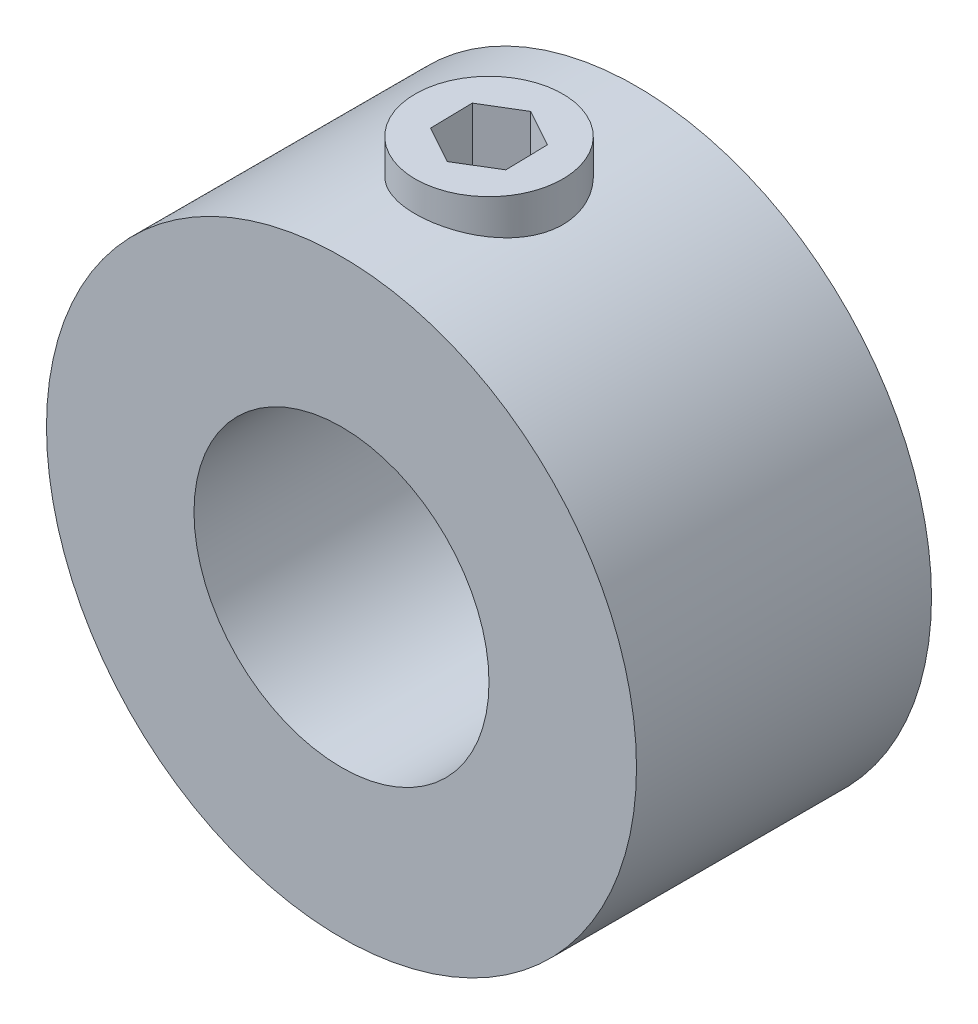
ISO-10303-21;
HEADER;
FILE_DESCRIPTION(('STEP AP214'),'2;1');
FILE_NAME('part.step','',(''),(''),'','','');
FILE_SCHEMA(('AUTOMOTIVE_DESIGN { 1 0 10303 214 1 1 1 1 }'));
ENDSEC;
DATA;
#1=APPLICATION_CONTEXT('core data for automotive mechanical design processes');
#2=APPLICATION_PROTOCOL_DEFINITION('international standard','automotive_design',2000,#1);
#3=PRODUCT_CONTEXT('',#1,'mechanical');
#4=PRODUCT('Part','Part','',(#3));
#5=PRODUCT_RELATED_PRODUCT_CATEGORY('part','',(#4));
#6=PRODUCT_DEFINITION_FORMATION('','',#4);
#7=PRODUCT_DEFINITION_CONTEXT('part definition',#1,'design');
#8=PRODUCT_DEFINITION('design','',#6,#7);
#9=PRODUCT_DEFINITION_SHAPE('','',#8);
#10=(LENGTH_UNIT() NAMED_UNIT(*) SI_UNIT(.MILLI.,.METRE.));
#11=(NAMED_UNIT(*) PLANE_ANGLE_UNIT() SI_UNIT($,.RADIAN.));
#12=(NAMED_UNIT(*) SI_UNIT($,.STERADIAN.) SOLID_ANGLE_UNIT());
#13=UNCERTAINTY_MEASURE_WITH_UNIT(LENGTH_MEASURE(1.E-05),#10,'distance_accuracy_value','');
#14=(GEOMETRIC_REPRESENTATION_CONTEXT(3) GLOBAL_UNCERTAINTY_ASSIGNED_CONTEXT((#13)) GLOBAL_UNIT_ASSIGNED_CONTEXT((#10,
#11,#12)) REPRESENTATION_CONTEXT('',''));
#15=CARTESIAN_POINT('',(0.,0.,0.));
#16=DIRECTION('',(0.,0.,1.));
#17=DIRECTION('',(1.,0.,0.));
#18=AXIS2_PLACEMENT_3D('',#15,#16,#17);
#19=CARTESIAN_POINT('',(0.,0.,6.35));
#20=DIRECTION('',(0.,0.,1.));
#21=DIRECTION('',(1.,0.,0.));
#22=AXIS2_PLACEMENT_3D('',#19,#20,#21);
#23=PLANE('',#22);
#24=CARTESIAN_POINT('',(0.,0.,6.35));
#25=DIRECTION('',(0.,0.,1.));
#26=DIRECTION('',(1.,0.,0.));
#27=AXIS2_PLACEMENT_3D('',#24,#25,#26);
#28=CIRCLE('',#27,6.35);
#29=CARTESIAN_POINT('',(6.35,0.,6.35));
#30=VERTEX_POINT('',#29);
#31=EDGE_CURVE('E11',#30,#30,#28,.T.);
#32=ORIENTED_EDGE('',*,*,#31,.T.);
#33=EDGE_LOOP('',(#32));
#34=FACE_BOUND('',#33,.T.);
#35=CARTESIAN_POINT('',(0.,0.,6.35));
#36=DIRECTION('',(0.,0.,1.));
#37=DIRECTION('',(1.,0.,0.));
#38=AXIS2_PLACEMENT_3D('',#35,#36,#37);
#39=CIRCLE('',#38,3.175);
#40=CARTESIAN_POINT('',(3.175,0.,6.35));
#41=VERTEX_POINT('',#40);
#42=EDGE_CURVE('E155',#41,#41,#39,.T.);
#43=ORIENTED_EDGE('',*,*,#42,.F.);
#44=EDGE_LOOP('',(#43));
#45=FACE_BOUND('',#44,.T.);
#46=ADVANCED_FACE('F36',(#34,#45),#23,.T.);
#47=CARTESIAN_POINT('',(0.,0.,0.));
#48=DIRECTION('',(0.,0.,1.));
#49=DIRECTION('',(1.,0.,0.));
#50=AXIS2_PLACEMENT_3D('',#47,#48,#49);
#51=PLANE('',#50);
#52=CARTESIAN_POINT('',(0.,0.,0.));
#53=DIRECTION('',(0.,0.,1.));
#54=DIRECTION('',(1.,0.,0.));
#55=AXIS2_PLACEMENT_3D('',#52,#53,#54);
#56=CIRCLE('',#55,6.35);
#57=CARTESIAN_POINT('',(6.35,0.,0.));
#58=VERTEX_POINT('',#57);
#59=EDGE_CURVE('E40',#58,#58,#56,.T.);
#60=ORIENTED_EDGE('',*,*,#59,.F.);
#61=EDGE_LOOP('',(#60));
#62=FACE_BOUND('',#61,.T.);
#63=CARTESIAN_POINT('',(0.,0.,0.));
#64=DIRECTION('',(0.,0.,1.));
#65=DIRECTION('',(1.,0.,0.));
#66=AXIS2_PLACEMENT_3D('',#63,#64,#65);
#67=CIRCLE('',#66,3.175);
#68=CARTESIAN_POINT('',(3.175,0.,0.));
#69=VERTEX_POINT('',#68);
#70=EDGE_CURVE('E154',#69,#69,#67,.T.);
#71=ORIENTED_EDGE('',*,*,#70,.T.);
#72=EDGE_LOOP('',(#71));
#73=FACE_BOUND('',#72,.T.);
#74=ADVANCED_FACE('F177',(#62,#73),#51,.F.);
#75=CARTESIAN_POINT('',(0.,0.,6.35));
#76=DIRECTION('',(0.,0.,-1.));
#77=DIRECTION('',(-1.,0.,0.));
#78=AXIS2_PLACEMENT_3D('',#75,#76,#77);
#79=CYLINDRICAL_SURFACE('',#78,6.35);
#80=CARTESIAN_POINT('',(0.,6.35,4.7625));
#81=CARTESIAN_POINT('',(0.0877105271754663,6.34999851693647,4.76249753859378));
#82=CARTESIAN_POINT('',(0.175448550370893,6.34816461856185,4.75520644209774));
#83=CARTESIAN_POINT('',(0.348410025990483,6.34102653803302,4.72627838153342));
#84=CARTESIAN_POINT('',(0.433632024604869,6.335720389028,4.70463328657244));
#85=CARTESIAN_POINT('',(0.599038756393231,6.32222537868075,4.64773512341929));
#86=CARTESIAN_POINT('',(0.679229404630089,6.31403998007875,4.61249839635967));
#87=CARTESIAN_POINT('',(0.832561339598851,6.29565822196369,4.52947469553588));
#88=CARTESIAN_POINT('',(0.905702388435767,6.28546179462203,4.48168729844079));
#89=CARTESIAN_POINT('',(1.04436537306014,6.2639301271799,4.37387916428262));
#90=CARTESIAN_POINT('',(1.10972143864797,6.25257731732197,4.3136485831682));
#91=CARTESIAN_POINT('',(1.2295176146235,6.23012914624385,4.18311308313806));
#92=CARTESIAN_POINT('',(1.28395649243784,6.21903381421835,4.11280702821496));
#93=CARTESIAN_POINT('',(1.38115309112898,6.1981797094886,3.96282838503621));
#94=CARTESIAN_POINT('',(1.42372526185434,6.18844324148057,3.88303216405899));
#95=CARTESIAN_POINT('',(1.49478672821597,6.17166548676269,3.7171329309949));
#96=CARTESIAN_POINT('',(1.52327827533996,6.16462376920368,3.63103092973024));
#97=CARTESIAN_POINT('',(1.56480386895121,6.15421337859408,3.45678813106905));
#98=CARTESIAN_POINT('',(1.57813615065278,6.15077394721492,3.36872273501396));
#99=CARTESIAN_POINT('',(1.58989371194681,6.14774575352442,3.1915432644602));
#100=CARTESIAN_POINT('',(1.58832141675737,6.14815636474815,3.1024293629273));
#101=CARTESIAN_POINT('',(1.57055240524324,6.15271825817254,2.92796827013709));
#102=CARTESIAN_POINT('',(1.55471107670163,6.15677863343655,2.84258213394944));
#103=CARTESIAN_POINT('',(1.50942059780579,6.16803767740945,2.67571955445222));
#104=CARTESIAN_POINT('',(1.47997047802348,6.17523656968987,2.59424339012766));
#105=CARTESIAN_POINT('',(1.40799553081682,6.19204495548597,2.43656059946656));
#106=CARTESIAN_POINT('',(1.3653417228215,6.20167804905137,2.36041546818939));
#107=CARTESIAN_POINT('',(1.26826039211583,6.22225610645758,2.21623603217401));
#108=CARTESIAN_POINT('',(1.21383080915602,6.23320129970928,2.14820314996215));
#109=CARTESIAN_POINT('',(1.09290212445429,6.25555306904602,2.02014284005676));
#110=CARTESIAN_POINT('',(1.02610312322553,6.2669639019752,1.9603989980184));
#111=CARTESIAN_POINT('',(0.883297612691412,6.28867980237548,1.85290751839237));
#112=CARTESIAN_POINT('',(0.807290822240903,6.29898483606464,1.80516024723773));
#113=CARTESIAN_POINT('',(0.647822648854467,6.31737933133009,1.72291312957919));
#114=CARTESIAN_POINT('',(0.564336557812455,6.32546106135176,1.68845934823073));
#115=CARTESIAN_POINT('',(0.392510441951212,6.33844212149251,1.6341541847907));
#116=CARTESIAN_POINT('',(0.304171349100923,6.34334206034072,1.61430000945747));
#117=CARTESIAN_POINT('',(0.127571468662774,6.34931736728872,1.5901907431169));
#118=CARTESIAN_POINT('',(0.0393665286541867,6.35048739962928,1.58554946407031));
#119=CARTESIAN_POINT('',(-0.13655979249826,6.34914068428627,1.59093852717539));
#120=CARTESIAN_POINT('',(-0.224281216457192,6.34662426847621,1.60096754862908));
#121=CARTESIAN_POINT('',(-0.395408434455115,6.33824806693119,1.63509421138088));
#122=CARTESIAN_POINT('',(-0.478858917575262,6.3324383784665,1.65898117051314));
#123=CARTESIAN_POINT('',(-0.640563967845575,6.31813047854458,1.71990499726344));
#124=CARTESIAN_POINT('',(-0.718818009309541,6.30963199558136,1.75694319289811));
#125=CARTESIAN_POINT('',(-0.869445317271592,6.29066250888678,1.84386656972576));
#126=CARTESIAN_POINT('',(-0.941689592609589,6.28015917963336,1.89396805228658));
#127=CARTESIAN_POINT('',(-1.07688233277244,6.25839605556685,2.00531932014346));
#128=CARTESIAN_POINT('',(-1.1398291899131,6.24713613041388,2.06657102942789));
#129=CARTESIAN_POINT('',(-1.25623168454364,6.22478812783483,2.20027707522706));
#130=CARTESIAN_POINT('',(-1.30941642656665,6.21371105264872,2.27296948567756));
#131=CARTESIAN_POINT('',(-1.4028322199551,6.19329129615911,2.42647537147622));
#132=CARTESIAN_POINT('',(-1.44306384631714,6.18394853787603,2.5072884861324));
#133=CARTESIAN_POINT('',(-1.50913192014483,6.16815816927521,2.67430855622051));
#134=CARTESIAN_POINT('',(-1.53505365312555,6.16169345183933,2.76048007333074));
#135=CARTESIAN_POINT('',(-1.57199082345108,6.15237470828777,2.93614436676597));
#136=CARTESIAN_POINT('',(-1.58300952074825,6.14951989253599,3.02563641234272));
#137=CARTESIAN_POINT('',(-1.58965750810348,6.14780437107521,3.20264475024676));
#138=CARTESIAN_POINT('',(-1.58571977515062,6.14883128804079,3.29014395217367));
#139=CARTESIAN_POINT('',(-1.56355761954778,6.15450370366633,3.46318828217361));
#140=CARTESIAN_POINT('',(-1.54533348401016,6.15914912960548,3.54873344948111));
#141=CARTESIAN_POINT('',(-1.49535231307696,6.17147250889214,3.71497061917755));
#142=CARTESIAN_POINT('',(-1.46367648662007,6.17913224458427,3.79568848137922));
#143=CARTESIAN_POINT('',(-1.3877553668987,6.19662374808777,3.95072169670532));
#144=CARTESIAN_POINT('',(-1.34350833028619,6.20645581711151,4.02503615995615));
#145=CARTESIAN_POINT('',(-1.24234336730764,6.22750462928883,4.1672453156938));
#146=CARTESIAN_POINT('',(-1.18512501408214,6.23875080280276,4.23492196937369));
#147=CARTESIAN_POINT('',(-1.06022708450914,6.26118495502319,4.3598539557418));
#148=CARTESIAN_POINT('',(-0.992545027501383,6.27237291927805,4.41710681020289));
#149=CARTESIAN_POINT('',(-0.847161529260245,6.29367185560443,4.52057696823088));
#150=CARTESIAN_POINT('',(-0.769300830284846,6.3037596531221,4.56657563280242));
#151=CARTESIAN_POINT('',(-0.606706579648589,6.32147712265334,4.64475773161206));
#152=CARTESIAN_POINT('',(-0.521978004637217,6.32910855503102,4.6769510650197));
#153=CARTESIAN_POINT('',(-0.364500851349341,6.33992529706865,4.72183018709888));
#154=CARTESIAN_POINT('',(-0.292502347544373,6.34367735847431,4.73704839889822));
#155=CARTESIAN_POINT('',(-0.147008925709233,6.34871523870479,4.75738395699989));
#156=CARTESIAN_POINT('',(-0.0735141206484356,6.35000124302196,4.76250206301478));
#157=CARTESIAN_POINT('',(0.,6.35,4.7625));
#158=B_SPLINE_CURVE_WITH_KNOTS('',3,(#80,#81,#82,#83,#84,#85,#86,#87,#88,#89,#90,#91,#92,#93,
#94,#95,#96,#97,#98,#99,#100,#101,#102,#103,#104,#105,#106,#107,#108,#109,#110,#111,#112,#113,
#114,#115,#116,#117,#118,#119,#120,#121,#122,#123,#124,#125,#126,#127,#128,#129,#130,#131,#132,
#133,#134,#135,#136,#137,#138,#139,#140,#141,#142,#143,#144,#145,#146,#147,#148,#149,#150,#151,
#152,#153,#154,#155,#156,#157),.UNSPECIFIED.,.T.,.F.,(4,2,2,2,2,2,2,2,2,2,2,2,2,2,2,2,2,2,2,2,2,
2,2,2,2,2,2,2,2,2,2,2,2,2,2,2,2,2,4),(0.,0.262862179032752,0.525873384966798,0.788569354919463,
1.0512741866792,1.31883610837639,1.58642822138899,1.85799568652646,2.12951971404248,
2.39560412313564,2.66164523669271,2.92123809332427,3.18084944501557,3.44308141999856,
3.70535931134939,3.97511588525546,4.24488069782479,4.51557209034646,4.78621167987148,
5.04992543637984,5.31361545344319,5.57339790527356,5.83320659749424,6.09762546839998,
6.36209000850153,6.63304605574737,6.90399007343229,7.17330136133188,7.44255372942131,
7.70407167588531,7.96558436678469,8.22554023925414,8.48553217944886,8.75230635033821,
9.01914386340358,9.29081396320397,9.56228893377595,9.78262207113774,10.0029386347888),.UNSPECIFIED.);
#159=CARTESIAN_POINT('',(0.,6.35,4.7625));
#160=VERTEX_POINT('',#159);
#161=EDGE_CURVE('E146',#160,#160,#158,.T.);
#162=ORIENTED_EDGE('',*,*,#161,.F.);
#163=EDGE_LOOP('',(#162));
#164=FACE_BOUND('',#163,.T.);
#165=ORIENTED_EDGE('',*,*,#31,.F.);
#166=EDGE_LOOP('',(#165));
#167=FACE_BOUND('',#166,.T.);
#168=ORIENTED_EDGE('',*,*,#59,.T.);
#169=EDGE_LOOP('',(#168));
#170=FACE_BOUND('',#169,.T.);
#171=ADVANCED_FACE('F38',(#164,#167,#170),#79,.T.);
#172=CARTESIAN_POINT('',(0.,0.,6.35));
#173=DIRECTION('',(0.,0.,-1.));
#174=DIRECTION('',(-1.,0.,0.));
#175=AXIS2_PLACEMENT_3D('',#172,#173,#174);
#176=CYLINDRICAL_SURFACE('',#175,3.175);
#177=ORIENTED_EDGE('',*,*,#42,.T.);
#178=EDGE_LOOP('',(#177));
#179=FACE_BOUND('',#178,.T.);
#180=ORIENTED_EDGE('',*,*,#70,.F.);
#181=EDGE_LOOP('',(#180));
#182=FACE_BOUND('',#181,.T.);
#183=ADVANCED_FACE('F167',(#179,#182),#176,.F.);
#184=CARTESIAN_POINT('',(0.,7.,3.175));
#185=DIRECTION('',(0.,1.,0.));
#186=DIRECTION('',(0.,0.,1.));
#187=AXIS2_PLACEMENT_3D('',#184,#185,#186);
#188=PLANE('',#187);
#189=DIRECTION('',(0.855892913729964,0.,-0.517153091672894));
#190=VECTOR('',#189,1.);
#191=CARTESIAN_POINT('',(0.0182587007296342,7.,4.09136166614552));
#192=LINE('',#191,#190);
#193=CARTESIAN_POINT('',(0.0182587007296342,7.,4.09136166614552));
#194=VERTEX_POINT('',#193);
#195=CARTESIAN_POINT('',(0.802721832301082,7.,3.61736833440079));
#196=VERTEX_POINT('',#195);
#197=EDGE_CURVE('E51',#194,#196,#192,.T.);
#198=ORIENTED_EDGE('',*,*,#197,.F.);
#199=DIRECTION('',(0.87581417189937,0.,0.482648460372786));
#200=VECTOR('',#199,1.);
#201=CARTESIAN_POINT('',(-0.784463131571433,7.,3.64899333174473));
#202=LINE('',#201,#200);
#203=CARTESIAN_POINT('',(-0.784463131571433,7.,3.64899333174473));
#204=VERTEX_POINT('',#203);
#205=EDGE_CURVE('E134',#204,#194,#202,.T.);
#206=ORIENTED_EDGE('',*,*,#205,.F.);
#207=DIRECTION('',(0.0199212581694063,0.,0.999801552045679));
#208=VECTOR('',#207,1.);
#209=CARTESIAN_POINT('',(-0.802721832301082,7.,2.7326316655992));
#210=LINE('',#209,#208);
#211=CARTESIAN_POINT('',(-0.802721832301082,7.,2.7326316655992));
#212=VERTEX_POINT('',#211);
#213=EDGE_CURVE('E132',#212,#204,#210,.T.);
#214=ORIENTED_EDGE('',*,*,#213,.F.);
#215=DIRECTION('',(-0.855892913729964,0.,0.517153091672893));
#216=VECTOR('',#215,1.);
#217=CARTESIAN_POINT('',(-0.0182587007296342,7.,2.25863833385448));
#218=LINE('',#217,#216);
#219=CARTESIAN_POINT('',(-0.0182587007296342,7.,2.25863833385448));
#220=VERTEX_POINT('',#219);
#221=EDGE_CURVE('E99',#220,#212,#218,.T.);
#222=ORIENTED_EDGE('',*,*,#221,.F.);
#223=DIRECTION('',(-0.87581417189937,0.,-0.482648460372785));
#224=VECTOR('',#223,1.);
#225=CARTESIAN_POINT('',(0.784463131571433,7.,2.70100666825527));
#226=LINE('',#225,#224);
#227=CARTESIAN_POINT('',(0.784463131571433,7.,2.70100666825527));
#228=VERTEX_POINT('',#227);
#229=EDGE_CURVE('E128',#228,#220,#226,.T.);
#230=ORIENTED_EDGE('',*,*,#229,.F.);
#231=DIRECTION('',(-0.0199212581694065,0.,-0.999801552045679));
#232=VECTOR('',#231,1.);
#233=CARTESIAN_POINT('',(0.802721832301082,7.,3.61736833440079));
#234=LINE('',#233,#232);
#235=EDGE_CURVE('E125',#196,#228,#234,.T.);
#236=ORIENTED_EDGE('',*,*,#235,.F.);
#237=EDGE_LOOP('',(#198,#206,#214,#222,#230,#236));
#238=FACE_BOUND('',#237,.T.);
#239=CARTESIAN_POINT('',(0.,7.,3.175));
#240=DIRECTION('',(0.,1.,0.));
#241=DIRECTION('',(0.,0.,1.));
#242=AXIS2_PLACEMENT_3D('',#239,#240,#241);
#243=CIRCLE('',#242,1.5875);
#244=CARTESIAN_POINT('',(0.,7.,4.7625));
#245=VERTEX_POINT('',#244);
#246=EDGE_CURVE('E138',#245,#245,#243,.T.);
#247=ORIENTED_EDGE('',*,*,#246,.T.);
#248=EDGE_LOOP('',(#247));
#249=FACE_BOUND('',#248,.T.);
#250=ADVANCED_FACE('F165',(#238,#249),#188,.T.);
#251=CARTESIAN_POINT('',(0.,-6.351,3.175));
#252=DIRECTION('',(0.,1.,0.));
#253=DIRECTION('',(0.,0.,1.));
#254=AXIS2_PLACEMENT_3D('',#251,#252,#253);
#255=CYLINDRICAL_SURFACE('',#254,1.5875);
#256=ORIENTED_EDGE('',*,*,#246,.F.);
#257=EDGE_LOOP('',(#256));
#258=FACE_BOUND('',#257,.T.);
#259=ORIENTED_EDGE('',*,*,#161,.T.);
#260=EDGE_LOOP('',(#259));
#261=FACE_BOUND('',#260,.T.);
#262=ADVANCED_FACE('F157',(#258,#261),#255,.T.);
#263=CARTESIAN_POINT('',(0.0182587007296342,4.,4.09136166614552));
#264=DIRECTION('',(0.517153091672894,0.,0.855892913729964));
#265=DIRECTION('',(0.855892913729964,0.,-0.517153091672894));
#266=AXIS2_PLACEMENT_3D('',#263,#264,#265);
#267=PLANE('',#266);
#268=ORIENTED_EDGE('',*,*,#197,.T.);
#269=DIRECTION('',(0.,1.,0.));
#270=VECTOR('',#269,1.);
#271=CARTESIAN_POINT('',(0.802721832301082,4.,3.61736833440079));
#272=LINE('',#271,#270);
#273=CARTESIAN_POINT('',(0.802721832301082,4.,3.61736833440079));
#274=VERTEX_POINT('',#273);
#275=EDGE_CURVE('E81',#274,#196,#272,.T.);
#276=ORIENTED_EDGE('',*,*,#275,.F.);
#277=DIRECTION('',(0.855892913729964,0.,-0.517153091672894));
#278=VECTOR('',#277,1.);
#279=CARTESIAN_POINT('',(0.0182587007296342,4.,4.09136166614552));
#280=LINE('',#279,#278);
#281=CARTESIAN_POINT('',(0.0182587007296342,4.,4.09136166614552));
#282=VERTEX_POINT('',#281);
#283=EDGE_CURVE('E136',#282,#274,#280,.T.);
#284=ORIENTED_EDGE('',*,*,#283,.F.);
#285=DIRECTION('',(0.,1.,0.));
#286=VECTOR('',#285,1.);
#287=CARTESIAN_POINT('',(0.0182587007296342,4.,4.09136166614552));
#288=LINE('',#287,#286);
#289=EDGE_CURVE('E59',#282,#194,#288,.T.);
#290=ORIENTED_EDGE('',*,*,#289,.T.);
#291=EDGE_LOOP('',(#268,#276,#284,#290));
#292=FACE_BOUND('',#291,.T.);
#293=ADVANCED_FACE('F163',(#292),#267,.F.);
#294=CARTESIAN_POINT('',(-0.784463131571433,4.,3.64899333174473));
#295=DIRECTION('',(-0.482648460372786,0.,0.87581417189937));
#296=DIRECTION('',(0.87581417189937,0.,0.482648460372786));
#297=AXIS2_PLACEMENT_3D('',#294,#295,#296);
#298=PLANE('',#297);
#299=ORIENTED_EDGE('',*,*,#205,.T.);
#300=ORIENTED_EDGE('',*,*,#289,.F.);
#301=DIRECTION('',(0.87581417189937,0.,0.482648460372786));
#302=VECTOR('',#301,1.);
#303=CARTESIAN_POINT('',(-0.784463131571433,4.,3.64899333174473));
#304=LINE('',#303,#302);
#305=CARTESIAN_POINT('',(-0.784463131571433,4.,3.64899333174473));
#306=VERTEX_POINT('',#305);
#307=EDGE_CURVE('E111',#306,#282,#304,.T.);
#308=ORIENTED_EDGE('',*,*,#307,.F.);
#309=DIRECTION('',(0.,1.,0.));
#310=VECTOR('',#309,1.);
#311=CARTESIAN_POINT('',(-0.784463131571433,4.,3.64899333174473));
#312=LINE('',#311,#310);
#313=EDGE_CURVE('E103',#306,#204,#312,.T.);
#314=ORIENTED_EDGE('',*,*,#313,.T.);
#315=EDGE_LOOP('',(#299,#300,#308,#314));
#316=FACE_BOUND('',#315,.T.);
#317=ADVANCED_FACE('F229',(#316),#298,.F.);
#318=CARTESIAN_POINT('',(-0.802721832301082,4.,2.7326316655992));
#319=DIRECTION('',(-0.999801552045679,0.,0.0199212581694063));
#320=DIRECTION('',(0.0199212581694063,0.,0.999801552045679));
#321=AXIS2_PLACEMENT_3D('',#318,#319,#320);
#322=PLANE('',#321);
#323=ORIENTED_EDGE('',*,*,#213,.T.);
#324=ORIENTED_EDGE('',*,*,#313,.F.);
#325=DIRECTION('',(0.0199212581694063,0.,0.999801552045679));
#326=VECTOR('',#325,1.);
#327=CARTESIAN_POINT('',(-0.802721832301082,4.,2.7326316655992));
#328=LINE('',#327,#326);
#329=CARTESIAN_POINT('',(-0.802721832301082,4.,2.7326316655992));
#330=VERTEX_POINT('',#329);
#331=EDGE_CURVE('E107',#330,#306,#328,.T.);
#332=ORIENTED_EDGE('',*,*,#331,.F.);
#333=DIRECTION('',(0.,1.,0.));
#334=VECTOR('',#333,1.);
#335=CARTESIAN_POINT('',(-0.802721832301082,4.,2.7326316655992));
#336=LINE('',#335,#334);
#337=EDGE_CURVE('E92',#330,#212,#336,.T.);
#338=ORIENTED_EDGE('',*,*,#337,.T.);
#339=EDGE_LOOP('',(#323,#324,#332,#338));
#340=FACE_BOUND('',#339,.T.);
#341=ADVANCED_FACE('F108',(#340),#322,.F.);
#342=CARTESIAN_POINT('',(-0.0182587007296342,4.,2.25863833385448));
#343=DIRECTION('',(-0.517153091672893,0.,-0.855892913729964));
#344=DIRECTION('',(-0.855892913729964,0.,0.517153091672894));
#345=AXIS2_PLACEMENT_3D('',#342,#343,#344);
#346=PLANE('',#345);
#347=ORIENTED_EDGE('',*,*,#221,.T.);
#348=ORIENTED_EDGE('',*,*,#337,.F.);
#349=DIRECTION('',(-0.855892913729964,0.,0.517153091672893));
#350=VECTOR('',#349,1.);
#351=CARTESIAN_POINT('',(-0.0182587007296342,4.,2.25863833385448));
#352=LINE('',#351,#350);
#353=CARTESIAN_POINT('',(-0.0182587007296342,4.,2.25863833385448));
#354=VERTEX_POINT('',#353);
#355=EDGE_CURVE('E96',#354,#330,#352,.T.);
#356=ORIENTED_EDGE('',*,*,#355,.F.);
#357=DIRECTION('',(0.,1.,0.));
#358=VECTOR('',#357,1.);
#359=CARTESIAN_POINT('',(-0.0182587007296342,4.,2.25863833385448));
#360=LINE('',#359,#358);
#361=EDGE_CURVE('E104',#354,#220,#360,.T.);
#362=ORIENTED_EDGE('',*,*,#361,.T.);
#363=EDGE_LOOP('',(#347,#348,#356,#362));
#364=FACE_BOUND('',#363,.T.);
#365=ADVANCED_FACE('F94',(#364),#346,.F.);
#366=CARTESIAN_POINT('',(0.784463131571433,4.,2.70100666825527));
#367=DIRECTION('',(0.482648460372785,0.,-0.87581417189937));
#368=DIRECTION('',(-0.875814171899371,0.,-0.482648460372785));
#369=AXIS2_PLACEMENT_3D('',#366,#367,#368);
#370=PLANE('',#369);
#371=ORIENTED_EDGE('',*,*,#229,.T.);
#372=ORIENTED_EDGE('',*,*,#361,.F.);
#373=DIRECTION('',(-0.87581417189937,0.,-0.482648460372785));
#374=VECTOR('',#373,1.);
#375=CARTESIAN_POINT('',(0.784463131571433,4.,2.70100666825527));
#376=LINE('',#375,#374);
#377=CARTESIAN_POINT('',(0.784463131571433,4.,2.70100666825527));
#378=VERTEX_POINT('',#377);
#379=EDGE_CURVE('E117',#378,#354,#376,.T.);
#380=ORIENTED_EDGE('',*,*,#379,.F.);
#381=DIRECTION('',(0.,1.,0.));
#382=VECTOR('',#381,1.);
#383=CARTESIAN_POINT('',(0.784463131571433,4.,2.70100666825527));
#384=LINE('',#383,#382);
#385=EDGE_CURVE('E141',#378,#228,#384,.T.);
#386=ORIENTED_EDGE('',*,*,#385,.T.);
#387=EDGE_LOOP('',(#371,#372,#380,#386));
#388=FACE_BOUND('',#387,.T.);
#389=ADVANCED_FACE('F253',(#388),#370,.F.);
#390=CARTESIAN_POINT('',(0.802721832301082,4.,3.61736833440079));
#391=DIRECTION('',(0.999801552045679,0.,-0.0199212581694065));
#392=DIRECTION('',(-0.0199212581694065,0.,-0.999801552045679));
#393=AXIS2_PLACEMENT_3D('',#390,#391,#392);
#394=PLANE('',#393);
#395=ORIENTED_EDGE('',*,*,#235,.T.);
#396=ORIENTED_EDGE('',*,*,#385,.F.);
#397=DIRECTION('',(-0.0199212581694065,0.,-0.999801552045679));
#398=VECTOR('',#397,1.);
#399=CARTESIAN_POINT('',(0.802721832301082,4.,3.61736833440079));
#400=LINE('',#399,#398);
#401=EDGE_CURVE('E119',#274,#378,#400,.T.);
#402=ORIENTED_EDGE('',*,*,#401,.F.);
#403=ORIENTED_EDGE('',*,*,#275,.T.);
#404=EDGE_LOOP('',(#395,#396,#402,#403));
#405=FACE_BOUND('',#404,.T.);
#406=ADVANCED_FACE('F261',(#405),#394,.F.);
#407=CARTESIAN_POINT('',(0.,4.,0.));
#408=DIRECTION('',(0.,1.,0.));
#409=DIRECTION('',(0.,0.,1.));
#410=AXIS2_PLACEMENT_3D('',#407,#408,#409);
#411=PLANE('',#410);
#412=ORIENTED_EDGE('',*,*,#283,.T.);
#413=ORIENTED_EDGE('',*,*,#401,.T.);
#414=ORIENTED_EDGE('',*,*,#379,.T.);
#415=ORIENTED_EDGE('',*,*,#355,.T.);
#416=ORIENTED_EDGE('',*,*,#331,.T.);
#417=ORIENTED_EDGE('',*,*,#307,.T.);
#418=EDGE_LOOP('',(#412,#413,#414,#415,#416,#417));
#419=FACE_BOUND('',#418,.T.);
#420=ADVANCED_FACE('F114',(#419),#411,.T.);
#421=CLOSED_SHELL('',(#46,#74,#171,#183,#250,#262,#293,#317,#341,#365,#389,#406,#420));
#422=MANIFOLD_SOLID_BREP('B2',#421);
#423=ADVANCED_BREP_SHAPE_REPRESENTATION('',(#18,#422),#14);
#424=SHAPE_DEFINITION_REPRESENTATION(#9,#423);
ENDSEC;
END-ISO-10303-21;
